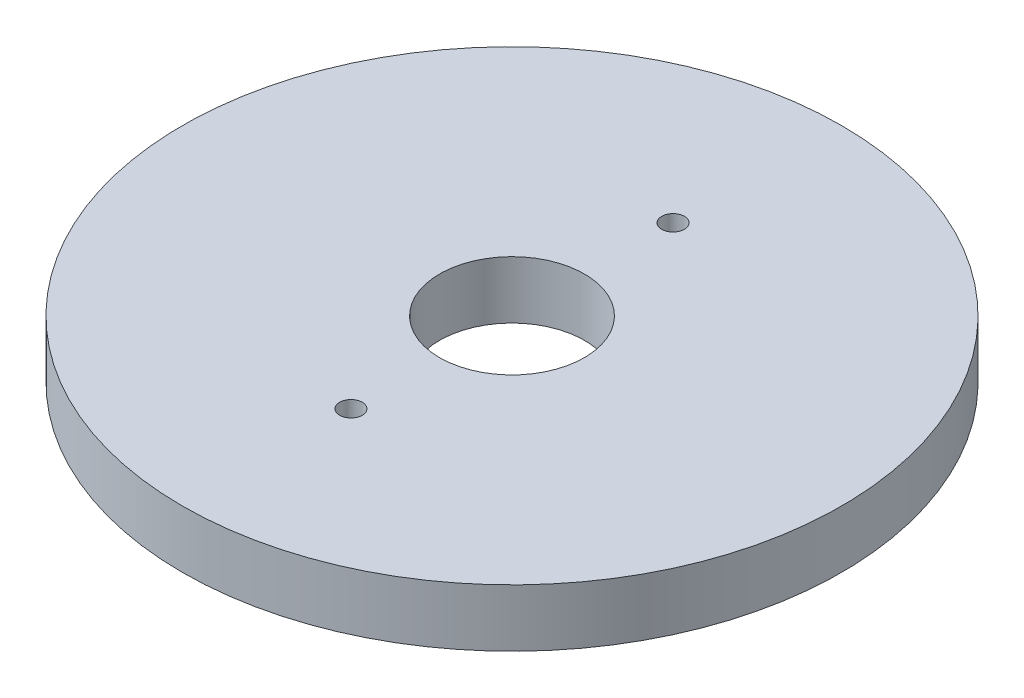
ISO-10303-21;
HEADER;
FILE_DESCRIPTION(('STEP AP214'),'2;1');
FILE_NAME('part.step','',(''),(''),'','','');
FILE_SCHEMA(('AUTOMOTIVE_DESIGN { 1 0 10303 214 1 1 1 1 }'));
ENDSEC;
DATA;
#1=APPLICATION_CONTEXT('core data for automotive mechanical design processes');
#2=APPLICATION_PROTOCOL_DEFINITION('international standard','automotive_design',2000,#1);
#3=PRODUCT_CONTEXT('',#1,'mechanical');
#4=PRODUCT('Part','Part','',(#3));
#5=PRODUCT_RELATED_PRODUCT_CATEGORY('part','',(#4));
#6=PRODUCT_DEFINITION_FORMATION('','',#4);
#7=PRODUCT_DEFINITION_CONTEXT('part definition',#1,'design');
#8=PRODUCT_DEFINITION('design','',#6,#7);
#9=PRODUCT_DEFINITION_SHAPE('','',#8);
#10=(LENGTH_UNIT() NAMED_UNIT(*) SI_UNIT(.MILLI.,.METRE.));
#11=(NAMED_UNIT(*) PLANE_ANGLE_UNIT() SI_UNIT($,.RADIAN.));
#12=(NAMED_UNIT(*) SI_UNIT($,.STERADIAN.) SOLID_ANGLE_UNIT());
#13=UNCERTAINTY_MEASURE_WITH_UNIT(LENGTH_MEASURE(1.E-05),#10,'distance_accuracy_value','');
#14=(GEOMETRIC_REPRESENTATION_CONTEXT(3) GLOBAL_UNCERTAINTY_ASSIGNED_CONTEXT((#13)) GLOBAL_UNIT_ASSIGNED_CONTEXT((#10,
#11,#12)) REPRESENTATION_CONTEXT('',''));
#15=CARTESIAN_POINT('',(0.,0.,0.));
#16=DIRECTION('',(0.,0.,1.));
#17=DIRECTION('',(1.,0.,0.));
#18=AXIS2_PLACEMENT_3D('',#15,#16,#17);
#19=CARTESIAN_POINT('',(0.,6.35,0.));
#20=DIRECTION('',(0.,-1.,0.));
#21=DIRECTION('',(0.,0.,-1.));
#22=AXIS2_PLACEMENT_3D('',#19,#20,#21);
#23=CYLINDRICAL_SURFACE('',#22,36.3855);
#24=CARTESIAN_POINT('',(0.,6.35,0.));
#25=DIRECTION('',(0.,1.,0.));
#26=DIRECTION('',(0.,0.,1.));
#27=AXIS2_PLACEMENT_3D('',#24,#25,#26);
#28=CIRCLE('',#27,36.3855);
#29=CARTESIAN_POINT('',(0.,6.35,36.3855));
#30=VERTEX_POINT('',#29);
#31=EDGE_CURVE('E11',#30,#30,#28,.T.);
#32=ORIENTED_EDGE('',*,*,#31,.F.);
#33=EDGE_LOOP('',(#32));
#34=FACE_BOUND('',#33,.T.);
#35=CARTESIAN_POINT('',(0.,0.,0.));
#36=DIRECTION('',(0.,1.,0.));
#37=DIRECTION('',(0.,0.,1.));
#38=AXIS2_PLACEMENT_3D('',#35,#36,#37);
#39=CIRCLE('',#38,36.3855);
#40=CARTESIAN_POINT('',(0.,0.,36.3855));
#41=VERTEX_POINT('',#40);
#42=EDGE_CURVE('E38',#41,#41,#39,.T.);
#43=ORIENTED_EDGE('',*,*,#42,.T.);
#44=EDGE_LOOP('',(#43));
#45=FACE_BOUND('',#44,.T.);
#46=ADVANCED_FACE('F35',(#34,#45),#23,.T.);
#47=CARTESIAN_POINT('',(0.,6.35,0.));
#48=DIRECTION('',(0.,1.,0.));
#49=DIRECTION('',(0.,0.,1.));
#50=AXIS2_PLACEMENT_3D('',#47,#48,#49);
#51=PLANE('',#50);
#52=CARTESIAN_POINT('',(0.,6.35,0.));
#53=DIRECTION('',(0.,1.,0.));
#54=DIRECTION('',(0.,0.,1.));
#55=AXIS2_PLACEMENT_3D('',#52,#53,#54);
#56=CIRCLE('',#55,8.001);
#57=CARTESIAN_POINT('',(0.,6.35,8.001));
#58=VERTEX_POINT('',#57);
#59=EDGE_CURVE('E151',#58,#58,#56,.T.);
#60=ORIENTED_EDGE('',*,*,#59,.F.);
#61=EDGE_LOOP('',(#60));
#62=FACE_BOUND('',#61,.T.);
#63=CARTESIAN_POINT('',(0.,6.35,-17.78));
#64=DIRECTION('',(0.,1.,0.));
#65=DIRECTION('',(0.,0.,1.));
#66=AXIS2_PLACEMENT_3D('',#63,#64,#65);
#67=CIRCLE('',#66,1.24999999999999);
#68=CARTESIAN_POINT('',(0.,6.35,-16.53));
#69=VERTEX_POINT('',#68);
#70=EDGE_CURVE('E59',#69,#69,#67,.T.);
#71=ORIENTED_EDGE('',*,*,#70,.F.);
#72=EDGE_LOOP('',(#71));
#73=FACE_BOUND('',#72,.T.);
#74=CARTESIAN_POINT('',(0.,6.35,17.78));
#75=DIRECTION('',(0.,1.,0.));
#76=DIRECTION('',(0.,0.,1.));
#77=AXIS2_PLACEMENT_3D('',#74,#75,#76);
#78=CIRCLE('',#77,1.24999999999999);
#79=CARTESIAN_POINT('',(0.,6.35,19.03));
#80=VERTEX_POINT('',#79);
#81=EDGE_CURVE('E58',#80,#80,#78,.T.);
#82=ORIENTED_EDGE('',*,*,#81,.F.);
#83=EDGE_LOOP('',(#82));
#84=FACE_BOUND('',#83,.T.);
#85=ORIENTED_EDGE('',*,*,#31,.T.);
#86=EDGE_LOOP('',(#85));
#87=FACE_BOUND('',#86,.T.);
#88=ADVANCED_FACE('F79',(#62,#73,#84,#87),#51,.T.);
#89=CARTESIAN_POINT('',(0.,0.,0.));
#90=DIRECTION('',(0.,1.,0.));
#91=DIRECTION('',(0.,0.,1.));
#92=AXIS2_PLACEMENT_3D('',#89,#90,#91);
#93=PLANE('',#92);
#94=CARTESIAN_POINT('',(0.,0.,0.));
#95=DIRECTION('',(0.,1.,0.));
#96=DIRECTION('',(0.,0.,1.));
#97=AXIS2_PLACEMENT_3D('',#94,#95,#96);
#98=CIRCLE('',#97,8.001);
#99=CARTESIAN_POINT('',(0.,0.,8.001));
#100=VERTEX_POINT('',#99);
#101=EDGE_CURVE('E65',#100,#100,#98,.T.);
#102=ORIENTED_EDGE('',*,*,#101,.T.);
#103=EDGE_LOOP('',(#102));
#104=FACE_BOUND('',#103,.T.);
#105=ORIENTED_EDGE('',*,*,#42,.F.);
#106=EDGE_LOOP('',(#105));
#107=FACE_BOUND('',#106,.T.);
#108=ADVANCED_FACE('F76',(#104,#107),#93,.F.);
#109=CARTESIAN_POINT('',(0.,3.175,17.78));
#110=DIRECTION('',(0.,1.,0.));
#111=DIRECTION('',(0.,0.,1.));
#112=AXIS2_PLACEMENT_3D('',#109,#110,#111);
#113=CONICAL_SURFACE('',#112,1.24999999999999,1.02974425867665);
#114=CARTESIAN_POINT('',(0.,2.42392422621556,17.78));
#115=VERTEX_POINT('',#114);
#116=VERTEX_LOOP('',#115);
#117=FACE_BOUND('',#116,.T.);
#118=CARTESIAN_POINT('',(0.,3.175,17.78));
#119=DIRECTION('',(0.,1.,0.));
#120=DIRECTION('',(0.,0.,1.));
#121=AXIS2_PLACEMENT_3D('',#118,#119,#120);
#122=CIRCLE('',#121,1.24999999999999);
#123=CARTESIAN_POINT('',(0.,3.175,19.03));
#124=VERTEX_POINT('',#123);
#125=EDGE_CURVE('E62',#124,#124,#122,.T.);
#126=ORIENTED_EDGE('',*,*,#125,.T.);
#127=EDGE_LOOP('',(#126));
#128=FACE_BOUND('',#127,.T.);
#129=ADVANCED_FACE('F78',(#117,#128),#113,.F.);
#130=CARTESIAN_POINT('',(0.,6.35,17.78));
#131=DIRECTION('',(0.,1.,0.));
#132=DIRECTION('',(0.,0.,1.));
#133=AXIS2_PLACEMENT_3D('',#130,#131,#132);
#134=CYLINDRICAL_SURFACE('',#133,1.24999999999999);
#135=ORIENTED_EDGE('',*,*,#125,.F.);
#136=EDGE_LOOP('',(#135));
#137=FACE_BOUND('',#136,.T.);
#138=ORIENTED_EDGE('',*,*,#81,.T.);
#139=EDGE_LOOP('',(#138));
#140=FACE_BOUND('',#139,.T.);
#141=ADVANCED_FACE('F52',(#137,#140),#134,.F.);
#142=CARTESIAN_POINT('',(0.,3.175,-17.78));
#143=DIRECTION('',(0.,1.,0.));
#144=DIRECTION('',(0.,0.,1.));
#145=AXIS2_PLACEMENT_3D('',#142,#143,#144);
#146=CONICAL_SURFACE('',#145,1.24999999999999,1.02974425867665);
#147=CARTESIAN_POINT('',(0.,2.42392422621556,-17.78));
#148=VERTEX_POINT('',#147);
#149=VERTEX_LOOP('',#148);
#150=FACE_BOUND('',#149,.T.);
#151=CARTESIAN_POINT('',(0.,3.175,-17.78));
#152=DIRECTION('',(0.,1.,0.));
#153=DIRECTION('',(0.,0.,1.));
#154=AXIS2_PLACEMENT_3D('',#151,#152,#153);
#155=CIRCLE('',#154,1.24999999999999);
#156=CARTESIAN_POINT('',(0.,3.175,-16.53));
#157=VERTEX_POINT('',#156);
#158=EDGE_CURVE('E56',#157,#157,#155,.T.);
#159=ORIENTED_EDGE('',*,*,#158,.T.);
#160=EDGE_LOOP('',(#159));
#161=FACE_BOUND('',#160,.T.);
#162=ADVANCED_FACE('F48',(#150,#161),#146,.F.);
#163=CARTESIAN_POINT('',(0.,6.35,-17.78));
#164=DIRECTION('',(0.,1.,0.));
#165=DIRECTION('',(0.,0.,1.));
#166=AXIS2_PLACEMENT_3D('',#163,#164,#165);
#167=CYLINDRICAL_SURFACE('',#166,1.24999999999999);
#168=ORIENTED_EDGE('',*,*,#158,.F.);
#169=EDGE_LOOP('',(#168));
#170=FACE_BOUND('',#169,.T.);
#171=ORIENTED_EDGE('',*,*,#70,.T.);
#172=EDGE_LOOP('',(#171));
#173=FACE_BOUND('',#172,.T.);
#174=ADVANCED_FACE('F51',(#170,#173),#167,.F.);
#175=CARTESIAN_POINT('',(0.,0.,0.));
#176=DIRECTION('',(0.,1.,0.));
#177=DIRECTION('',(0.,0.,1.));
#178=AXIS2_PLACEMENT_3D('',#175,#176,#177);
#179=CYLINDRICAL_SURFACE('',#178,8.001);
#180=ORIENTED_EDGE('',*,*,#101,.F.);
#181=EDGE_LOOP('',(#180));
#182=FACE_BOUND('',#181,.T.);
#183=ORIENTED_EDGE('',*,*,#59,.T.);
#184=EDGE_LOOP('',(#183));
#185=FACE_BOUND('',#184,.T.);
#186=ADVANCED_FACE('F128',(#182,#185),#179,.F.);
#187=CLOSED_SHELL('',(#46,#88,#108,#129,#141,#162,#174,#186));
#188=MANIFOLD_SOLID_BREP('B2',#187);
#189=ADVANCED_BREP_SHAPE_REPRESENTATION('',(#18,#188),#14);
#190=SHAPE_DEFINITION_REPRESENTATION(#9,#189);
ENDSEC;
END-ISO-10303-21;
